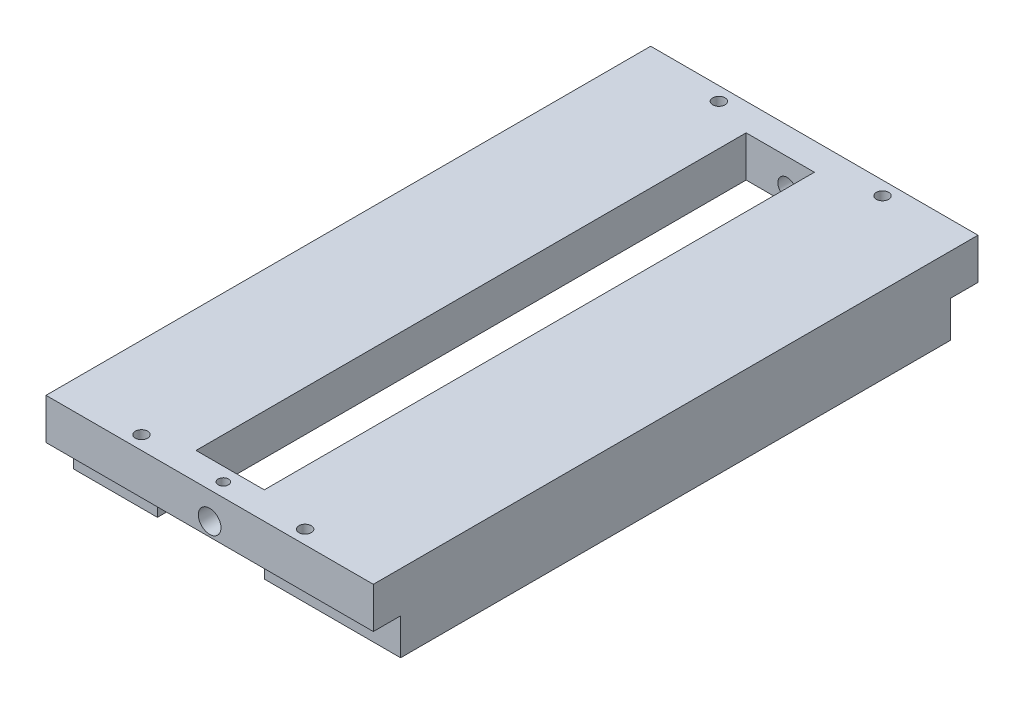
ISO-10303-21;
HEADER;
FILE_DESCRIPTION(('STEP AP214'),'2;1');
FILE_NAME('part.step','',(''),(''),'','','');
FILE_SCHEMA(('AUTOMOTIVE_DESIGN { 1 0 10303 214 1 1 1 1 }'));
ENDSEC;
DATA;
#1=APPLICATION_CONTEXT('core data for automotive mechanical design processes');
#2=APPLICATION_PROTOCOL_DEFINITION('international standard','automotive_design',2000,#1);
#3=PRODUCT_CONTEXT('',#1,'mechanical');
#4=PRODUCT('Part','Part','',(#3));
#5=PRODUCT_RELATED_PRODUCT_CATEGORY('part','',(#4));
#6=PRODUCT_DEFINITION_FORMATION('','',#4);
#7=PRODUCT_DEFINITION_CONTEXT('part definition',#1,'design');
#8=PRODUCT_DEFINITION('design','',#6,#7);
#9=PRODUCT_DEFINITION_SHAPE('','',#8);
#10=(LENGTH_UNIT() NAMED_UNIT(*) SI_UNIT(.MILLI.,.METRE.));
#11=(NAMED_UNIT(*) PLANE_ANGLE_UNIT() SI_UNIT($,.RADIAN.));
#12=(NAMED_UNIT(*) SI_UNIT($,.STERADIAN.) SOLID_ANGLE_UNIT());
#13=UNCERTAINTY_MEASURE_WITH_UNIT(LENGTH_MEASURE(1.E-05),#10,'distance_accuracy_value','');
#14=(GEOMETRIC_REPRESENTATION_CONTEXT(3) GLOBAL_UNCERTAINTY_ASSIGNED_CONTEXT((#13)) GLOBAL_UNIT_ASSIGNED_CONTEXT((#10,
#11,#12)) REPRESENTATION_CONTEXT('',''));
#15=CARTESIAN_POINT('',(0.,0.,0.));
#16=DIRECTION('',(0.,0.,1.));
#17=DIRECTION('',(1.,0.,0.));
#18=AXIS2_PLACEMENT_3D('',#15,#16,#17);
#19=CARTESIAN_POINT('',(0.,-9.,0.));
#20=DIRECTION('',(0.,1.,0.));
#21=DIRECTION('',(0.,0.,1.));
#22=AXIS2_PLACEMENT_3D('',#19,#20,#21);
#23=PLANE('',#22);
#24=CARTESIAN_POINT('',(-18.,-9.,-63.5));
#25=DIRECTION('',(0.,1.,0.));
#26=DIRECTION('',(0.,0.,1.));
#27=AXIS2_PLACEMENT_3D('',#24,#25,#26);
#28=CIRCLE('',#27,1.35254999999999);
#29=CARTESIAN_POINT('',(-18.,-9.,-62.14745));
#30=VERTEX_POINT('',#29);
#31=EDGE_CURVE('E427',#30,#30,#28,.T.);
#32=ORIENTED_EDGE('',*,*,#31,.T.);
#33=EDGE_LOOP('',(#32));
#34=FACE_BOUND('',#33,.T.);
#35=CARTESIAN_POINT('',(18.,-9.,-63.5));
#36=DIRECTION('',(0.,1.,0.));
#37=DIRECTION('',(0.,0.,1.));
#38=AXIS2_PLACEMENT_3D('',#35,#36,#37);
#39=CIRCLE('',#38,1.35254999999999);
#40=CARTESIAN_POINT('',(18.,-9.,-62.14745));
#41=VERTEX_POINT('',#40);
#42=EDGE_CURVE('E433',#41,#41,#39,.T.);
#43=ORIENTED_EDGE('',*,*,#42,.T.);
#44=EDGE_LOOP('',(#43));
#45=FACE_BOUND('',#44,.T.);
#46=CARTESIAN_POINT('',(18.,-9.,63.5));
#47=DIRECTION('',(0.,1.,0.));
#48=DIRECTION('',(0.,0.,1.));
#49=AXIS2_PLACEMENT_3D('',#46,#47,#48);
#50=CIRCLE('',#49,1.35254999999999);
#51=CARTESIAN_POINT('',(18.,-9.,64.85255));
#52=VERTEX_POINT('',#51);
#53=EDGE_CURVE('E56',#52,#52,#50,.T.);
#54=ORIENTED_EDGE('',*,*,#53,.T.);
#55=EDGE_LOOP('',(#54));
#56=FACE_BOUND('',#55,.T.);
#57=CARTESIAN_POINT('',(-18.,-9.,63.5));
#58=DIRECTION('',(0.,1.,0.));
#59=DIRECTION('',(0.,0.,1.));
#60=AXIS2_PLACEMENT_3D('',#57,#58,#59);
#61=CIRCLE('',#60,1.35254999999999);
#62=CARTESIAN_POINT('',(-18.,-9.,64.85255));
#63=VERTEX_POINT('',#62);
#64=EDGE_CURVE('E442',#63,#63,#61,.T.);
#65=ORIENTED_EDGE('',*,*,#64,.T.);
#66=EDGE_LOOP('',(#65));
#67=FACE_BOUND('',#66,.T.);
#68=DIRECTION('',(1.,0.,0.));
#69=VECTOR('',#68,1.);
#70=CARTESIAN_POINT('',(-42.875,-9.,-60.5));
#71=LINE('',#70,#69);
#72=CARTESIAN_POINT('',(6.0127,-9.,-60.5));
#73=VERTEX_POINT('',#72);
#74=CARTESIAN_POINT('',(36.,-9.,-60.5));
#75=VERTEX_POINT('',#74);
#76=EDGE_CURVE('E171',#73,#75,#71,.T.);
#77=ORIENTED_EDGE('',*,*,#76,.F.);
#78=DIRECTION('',(-1.,0.,0.));
#79=VECTOR('',#78,1.);
#80=CARTESIAN_POINT('',(0.,-9.,-60.5));
#81=LINE('',#80,#79);
#82=CARTESIAN_POINT('',(-9.,-9.,-60.5));
#83=VERTEX_POINT('',#82);
#84=EDGE_CURVE('E174',#73,#83,#81,.T.);
#85=ORIENTED_EDGE('',*,*,#84,.T.);
#86=DIRECTION('',(0.,0.,1.));
#87=VECTOR('',#86,1.);
#88=CARTESIAN_POINT('',(-9.,-9.,0.));
#89=LINE('',#88,#87);
#90=CARTESIAN_POINT('',(-9.,-9.,60.5));
#91=VERTEX_POINT('',#90);
#92=EDGE_CURVE('E193',#83,#91,#89,.T.);
#93=ORIENTED_EDGE('',*,*,#92,.T.);
#94=DIRECTION('',(1.,0.,0.));
#95=VECTOR('',#94,1.);
#96=CARTESIAN_POINT('',(0.,-9.,60.5));
#97=LINE('',#96,#95);
#98=CARTESIAN_POINT('',(6.01270000000001,-9.,60.5));
#99=VERTEX_POINT('',#98);
#100=EDGE_CURVE('E256',#91,#99,#97,.T.);
#101=ORIENTED_EDGE('',*,*,#100,.T.);
#102=DIRECTION('',(-1.,0.,0.));
#103=VECTOR('',#102,1.);
#104=CARTESIAN_POINT('',(-42.875,-9.,60.5));
#105=LINE('',#104,#103);
#106=CARTESIAN_POINT('',(36.,-9.,60.5));
#107=VERTEX_POINT('',#106);
#108=EDGE_CURVE('E182',#107,#99,#105,.T.);
#109=ORIENTED_EDGE('',*,*,#108,.F.);
#110=DIRECTION('',(0.,0.,1.));
#111=VECTOR('',#110,1.);
#112=CARTESIAN_POINT('',(36.,-9.,-66.501));
#113=LINE('',#112,#111);
#114=CARTESIAN_POINT('',(36.,-9.,66.5));
#115=VERTEX_POINT('',#114);
#116=EDGE_CURVE('E288',#107,#115,#113,.T.);
#117=ORIENTED_EDGE('',*,*,#116,.T.);
#118=DIRECTION('',(1.,0.,0.));
#119=VECTOR('',#118,1.);
#120=CARTESIAN_POINT('',(-45.5,-9.,66.5));
#121=LINE('',#120,#119);
#122=CARTESIAN_POINT('',(-36.,-9.,66.5));
#123=VERTEX_POINT('',#122);
#124=EDGE_CURVE('E62',#123,#115,#121,.T.);
#125=ORIENTED_EDGE('',*,*,#124,.F.);
#126=DIRECTION('',(0.,0.,1.));
#127=VECTOR('',#126,1.);
#128=CARTESIAN_POINT('',(-36.,-9.,-66.501));
#129=LINE('',#128,#127);
#130=CARTESIAN_POINT('',(-36.,-9.,60.5));
#131=VERTEX_POINT('',#130);
#132=EDGE_CURVE('E453',#131,#123,#129,.T.);
#133=ORIENTED_EDGE('',*,*,#132,.F.);
#134=CARTESIAN_POINT('',(-17.5,-9.,60.5));
#135=VERTEX_POINT('',#134);
#136=EDGE_CURVE('E793',#135,#131,#105,.T.);
#137=ORIENTED_EDGE('',*,*,#136,.F.);
#138=DIRECTION('',(0.,0.,1.));
#139=VECTOR('',#138,1.);
#140=CARTESIAN_POINT('',(-17.5,-9.,-66.5));
#141=LINE('',#140,#139);
#142=CARTESIAN_POINT('',(-17.5,-9.,-60.5));
#143=VERTEX_POINT('',#142);
#144=EDGE_CURVE('E251',#143,#135,#141,.T.);
#145=ORIENTED_EDGE('',*,*,#144,.F.);
#146=CARTESIAN_POINT('',(-36.,-9.,-60.5));
#147=VERTEX_POINT('',#146);
#148=EDGE_CURVE('E181',#147,#143,#71,.T.);
#149=ORIENTED_EDGE('',*,*,#148,.F.);
#150=CARTESIAN_POINT('',(-36.,-9.,-66.5));
#151=VERTEX_POINT('',#150);
#152=EDGE_CURVE('E449',#151,#147,#129,.T.);
#153=ORIENTED_EDGE('',*,*,#152,.F.);
#154=DIRECTION('',(-1.,0.,0.));
#155=VECTOR('',#154,1.);
#156=CARTESIAN_POINT('',(45.5,-9.,-66.5));
#157=LINE('',#156,#155);
#158=CARTESIAN_POINT('',(36.,-9.,-66.5));
#159=VERTEX_POINT('',#158);
#160=EDGE_CURVE('E13',#159,#151,#157,.T.);
#161=ORIENTED_EDGE('',*,*,#160,.F.);
#162=EDGE_CURVE('E176',#159,#75,#113,.T.);
#163=ORIENTED_EDGE('',*,*,#162,.T.);
#164=EDGE_LOOP('',(#77,#85,#93,#101,#109,#117,#125,#133,#137,#145,#149,#153,#161,#163));
#165=FACE_BOUND('',#164,.T.);
#166=ADVANCED_FACE('F52',(#34,#45,#56,#67,#165),#23,.F.);
#167=CARTESIAN_POINT('',(-42.875,-17.,60.5));
#168=DIRECTION('',(0.,0.,-1.));
#169=DIRECTION('',(-1.,0.,0.));
#170=AXIS2_PLACEMENT_3D('',#167,#168,#169);
#171=PLANE('',#170);
#172=DIRECTION('',(0.,1.,0.));
#173=VECTOR('',#172,1.);
#174=CARTESIAN_POINT('',(-36.,-17.,60.5));
#175=LINE('',#174,#173);
#176=CARTESIAN_POINT('',(-36.,-17.,60.5));
#177=VERTEX_POINT('',#176);
#178=EDGE_CURVE('E266',#177,#131,#175,.T.);
#179=ORIENTED_EDGE('',*,*,#178,.F.);
#180=DIRECTION('',(-1.,0.,0.));
#181=VECTOR('',#180,1.);
#182=CARTESIAN_POINT('',(-42.875,-17.,60.5));
#183=LINE('',#182,#181);
#184=CARTESIAN_POINT('',(-17.5,-17.,60.5));
#185=VERTEX_POINT('',#184);
#186=EDGE_CURVE('E304',#185,#177,#183,.T.);
#187=ORIENTED_EDGE('',*,*,#186,.F.);
#188=DIRECTION('',(0.,1.,0.));
#189=VECTOR('',#188,1.);
#190=CARTESIAN_POINT('',(-17.5,-17.,60.5));
#191=LINE('',#190,#189);
#192=EDGE_CURVE('E602',#185,#135,#191,.T.);
#193=ORIENTED_EDGE('',*,*,#192,.T.);
#194=ORIENTED_EDGE('',*,*,#136,.T.);
#195=EDGE_LOOP('',(#179,#187,#193,#194));
#196=FACE_BOUND('',#195,.T.);
#197=ADVANCED_FACE('F358',(#196),#171,.F.);
#198=CARTESIAN_POINT('',(-42.875,-17.,-60.5));
#199=DIRECTION('',(0.,0.,1.));
#200=DIRECTION('',(1.,0.,0.));
#201=AXIS2_PLACEMENT_3D('',#198,#199,#200);
#202=PLANE('',#201);
#203=DIRECTION('',(0.,-1.,0.));
#204=VECTOR('',#203,1.);
#205=CARTESIAN_POINT('',(-36.,-17.,-60.5));
#206=LINE('',#205,#204);
#207=CARTESIAN_POINT('',(-36.,-17.,-60.5));
#208=VERTEX_POINT('',#207);
#209=EDGE_CURVE('E271',#147,#208,#206,.T.);
#210=ORIENTED_EDGE('',*,*,#209,.F.);
#211=ORIENTED_EDGE('',*,*,#148,.T.);
#212=DIRECTION('',(0.,-1.,0.));
#213=VECTOR('',#212,1.);
#214=CARTESIAN_POINT('',(-17.5,-17.,-60.5));
#215=LINE('',#214,#213);
#216=CARTESIAN_POINT('',(-17.5,-17.,-60.5));
#217=VERTEX_POINT('',#216);
#218=EDGE_CURVE('E254',#143,#217,#215,.T.);
#219=ORIENTED_EDGE('',*,*,#218,.T.);
#220=DIRECTION('',(1.,0.,0.));
#221=VECTOR('',#220,1.);
#222=CARTESIAN_POINT('',(-42.875,-17.,-60.5));
#223=LINE('',#222,#221);
#224=EDGE_CURVE('E307',#208,#217,#223,.T.);
#225=ORIENTED_EDGE('',*,*,#224,.F.);
#226=EDGE_LOOP('',(#210,#211,#219,#225));
#227=FACE_BOUND('',#226,.T.);
#228=ADVANCED_FACE('F363',(#227),#202,.F.);
#229=CARTESIAN_POINT('',(0.,-17.,0.));
#230=DIRECTION('',(0.,-1.,0.));
#231=DIRECTION('',(0.,0.,-1.));
#232=AXIS2_PLACEMENT_3D('',#229,#230,#231);
#233=PLANE('',#232);
#234=ORIENTED_EDGE('',*,*,#186,.T.);
#235=DIRECTION('',(0.,0.,1.));
#236=VECTOR('',#235,1.);
#237=CARTESIAN_POINT('',(-36.,-17.,-66.5));
#238=LINE('',#237,#236);
#239=EDGE_CURVE('E214',#208,#177,#238,.T.);
#240=ORIENTED_EDGE('',*,*,#239,.F.);
#241=ORIENTED_EDGE('',*,*,#224,.T.);
#242=DIRECTION('',(0.,0.,1.));
#243=VECTOR('',#242,1.);
#244=CARTESIAN_POINT('',(-17.5,-17.,-66.5));
#245=LINE('',#244,#243);
#246=EDGE_CURVE('E255',#217,#185,#245,.T.);
#247=ORIENTED_EDGE('',*,*,#246,.T.);
#248=EDGE_LOOP('',(#234,#240,#241,#247));
#249=FACE_BOUND('',#248,.T.);
#250=ADVANCED_FACE('F373',(#249),#233,.T.);
#251=DIRECTION('',(0.,-1.,0.));
#252=VECTOR('',#251,1.);
#253=CARTESIAN_POINT('',(36.,-17.,60.5));
#254=LINE('',#253,#252);
#255=CARTESIAN_POINT('',(36.,-17.,60.5));
#256=VERTEX_POINT('',#255);
#257=EDGE_CURVE('E275',#107,#256,#254,.T.);
#258=ORIENTED_EDGE('',*,*,#257,.F.);
#259=ORIENTED_EDGE('',*,*,#108,.T.);
#260=DIRECTION('',(0.,1.,0.));
#261=VECTOR('',#260,1.);
#262=CARTESIAN_POINT('',(6.0127,-138.544058107708,60.5));
#263=LINE('',#262,#261);
#264=CARTESIAN_POINT('',(6.0127,-17.,60.5));
#265=VERTEX_POINT('',#264);
#266=EDGE_CURVE('E210',#265,#99,#263,.T.);
#267=ORIENTED_EDGE('',*,*,#266,.F.);
#268=EDGE_CURVE('E299',#256,#265,#183,.T.);
#269=ORIENTED_EDGE('',*,*,#268,.F.);
#270=EDGE_LOOP('',(#258,#259,#267,#269));
#271=FACE_BOUND('',#270,.T.);
#272=ADVANCED_FACE('F366',(#271),#171,.F.);
#273=DIRECTION('',(0.,1.,0.));
#274=VECTOR('',#273,1.);
#275=CARTESIAN_POINT('',(36.,-17.,-60.5));
#276=LINE('',#275,#274);
#277=CARTESIAN_POINT('',(36.,-17.,-60.5));
#278=VERTEX_POINT('',#277);
#279=EDGE_CURVE('E270',#278,#75,#276,.T.);
#280=ORIENTED_EDGE('',*,*,#279,.F.);
#281=CARTESIAN_POINT('',(6.0127,-17.,-60.5));
#282=VERTEX_POINT('',#281);
#283=EDGE_CURVE('E209',#282,#278,#223,.T.);
#284=ORIENTED_EDGE('',*,*,#283,.F.);
#285=DIRECTION('',(0.,1.,0.));
#286=VECTOR('',#285,1.);
#287=CARTESIAN_POINT('',(6.0127,-138.544058107708,-60.5));
#288=LINE('',#287,#286);
#289=EDGE_CURVE('E200',#282,#73,#288,.T.);
#290=ORIENTED_EDGE('',*,*,#289,.T.);
#291=ORIENTED_EDGE('',*,*,#76,.T.);
#292=EDGE_LOOP('',(#280,#284,#290,#291));
#293=FACE_BOUND('',#292,.T.);
#294=ADVANCED_FACE('F207',(#293),#202,.F.);
#295=ORIENTED_EDGE('',*,*,#283,.T.);
#296=DIRECTION('',(0.,0.,-1.));
#297=VECTOR('',#296,1.);
#298=CARTESIAN_POINT('',(36.,-17.,-66.5));
#299=LINE('',#298,#297);
#300=EDGE_CURVE('E809',#256,#278,#299,.T.);
#301=ORIENTED_EDGE('',*,*,#300,.F.);
#302=ORIENTED_EDGE('',*,*,#268,.T.);
#303=DIRECTION('',(0.,0.,-1.));
#304=VECTOR('',#303,1.);
#305=CARTESIAN_POINT('',(6.0127,-17.,60.5));
#306=LINE('',#305,#304);
#307=EDGE_CURVE('E211',#265,#282,#306,.T.);
#308=ORIENTED_EDGE('',*,*,#307,.T.);
#309=EDGE_LOOP('',(#295,#301,#302,#308));
#310=FACE_BOUND('',#309,.T.);
#311=CARTESIAN_POINT('',(12.7,-17.,-38.1));
#312=DIRECTION('',(0.,-1.,0.));
#313=DIRECTION('',(0.,0.,-1.));
#314=AXIS2_PLACEMENT_3D('',#311,#312,#313);
#315=CIRCLE('',#314,1.5875);
#316=CARTESIAN_POINT('',(12.7,-17.,-39.6875));
#317=VERTEX_POINT('',#316);
#318=EDGE_CURVE('E223',#317,#317,#315,.T.);
#319=ORIENTED_EDGE('',*,*,#318,.F.);
#320=EDGE_LOOP('',(#319));
#321=FACE_BOUND('',#320,.T.);
#322=CARTESIAN_POINT('',(12.7,-17.,38.1));
#323=DIRECTION('',(0.,-1.,0.));
#324=DIRECTION('',(0.,0.,-1.));
#325=AXIS2_PLACEMENT_3D('',#322,#323,#324);
#326=CIRCLE('',#325,1.5875);
#327=CARTESIAN_POINT('',(12.7,-17.,36.5125));
#328=VERTEX_POINT('',#327);
#329=EDGE_CURVE('E217',#328,#328,#326,.T.);
#330=ORIENTED_EDGE('',*,*,#329,.F.);
#331=EDGE_LOOP('',(#330));
#332=FACE_BOUND('',#331,.T.);
#333=ADVANCED_FACE('F378',(#310,#321,#332),#233,.T.);
#334=CARTESIAN_POINT('',(-45.5,-9.,66.5));
#335=DIRECTION('',(0.,0.,1.));
#336=DIRECTION('',(1.,0.,0.));
#337=AXIS2_PLACEMENT_3D('',#334,#335,#336);
#338=PLANE('',#337);
#339=DIRECTION('',(0.,-1.,0.));
#340=VECTOR('',#339,1.);
#341=CARTESIAN_POINT('',(36.,-9.,66.5));
#342=LINE('',#341,#340);
#343=CARTESIAN_POINT('',(36.,0.,66.5));
#344=VERTEX_POINT('',#343);
#345=EDGE_CURVE('E281',#344,#115,#342,.T.);
#346=ORIENTED_EDGE('',*,*,#345,.F.);
#347=DIRECTION('',(1.,0.,0.));
#348=VECTOR('',#347,1.);
#349=CARTESIAN_POINT('',(-45.5,0.,66.5));
#350=LINE('',#349,#348);
#351=CARTESIAN_POINT('',(-36.,0.,66.5));
#352=VERTEX_POINT('',#351);
#353=EDGE_CURVE('E469',#352,#344,#350,.T.);
#354=ORIENTED_EDGE('',*,*,#353,.F.);
#355=DIRECTION('',(0.,1.,0.));
#356=VECTOR('',#355,1.);
#357=CARTESIAN_POINT('',(-36.,-9.,66.5));
#358=LINE('',#357,#356);
#359=EDGE_CURVE('E456',#123,#352,#358,.T.);
#360=ORIENTED_EDGE('',*,*,#359,.F.);
#361=ORIENTED_EDGE('',*,*,#124,.T.);
#362=EDGE_LOOP('',(#346,#354,#360,#361));
#363=FACE_BOUND('',#362,.T.);
#364=CARTESIAN_POINT('',(0.,-6.,66.5));
#365=DIRECTION('',(0.,0.,1.));
#366=DIRECTION('',(1.,0.,0.));
#367=AXIS2_PLACEMENT_3D('',#364,#365,#366);
#368=CIRCLE('',#367,2.4892);
#369=CARTESIAN_POINT('',(2.4892,-6.,66.5));
#370=VERTEX_POINT('',#369);
#371=EDGE_CURVE('E321',#370,#370,#368,.T.);
#372=ORIENTED_EDGE('',*,*,#371,.F.);
#373=EDGE_LOOP('',(#372));
#374=FACE_BOUND('',#373,.T.);
#375=ADVANCED_FACE('F54',(#363,#374),#338,.T.);
#376=CARTESIAN_POINT('',(45.5,-9.,-66.5));
#377=DIRECTION('',(0.,0.,-1.));
#378=DIRECTION('',(-1.,0.,0.));
#379=AXIS2_PLACEMENT_3D('',#376,#377,#378);
#380=PLANE('',#379);
#381=DIRECTION('',(0.,-1.,0.));
#382=VECTOR('',#381,1.);
#383=CARTESIAN_POINT('',(36.,-9.,-66.5));
#384=LINE('',#383,#382);
#385=CARTESIAN_POINT('',(36.,0.,-66.5));
#386=VERTEX_POINT('',#385);
#387=EDGE_CURVE('E278',#386,#159,#384,.T.);
#388=ORIENTED_EDGE('',*,*,#387,.T.);
#389=ORIENTED_EDGE('',*,*,#160,.T.);
#390=DIRECTION('',(0.,1.,0.));
#391=VECTOR('',#390,1.);
#392=CARTESIAN_POINT('',(-36.,-9.,-66.5));
#393=LINE('',#392,#391);
#394=CARTESIAN_POINT('',(-36.,0.,-66.5));
#395=VERTEX_POINT('',#394);
#396=EDGE_CURVE('E277',#151,#395,#393,.T.);
#397=ORIENTED_EDGE('',*,*,#396,.T.);
#398=DIRECTION('',(-1.,0.,0.));
#399=VECTOR('',#398,1.);
#400=CARTESIAN_POINT('',(45.5,0.,-66.5));
#401=LINE('',#400,#399);
#402=EDGE_CURVE('E465',#386,#395,#401,.T.);
#403=ORIENTED_EDGE('',*,*,#402,.F.);
#404=EDGE_LOOP('',(#388,#389,#397,#403));
#405=FACE_BOUND('',#404,.T.);
#406=CARTESIAN_POINT('',(0.,-6.,-66.5));
#407=DIRECTION('',(0.,0.,-1.));
#408=DIRECTION('',(-1.,0.,0.));
#409=AXIS2_PLACEMENT_3D('',#406,#407,#408);
#410=CIRCLE('',#409,2.0193);
#411=CARTESIAN_POINT('',(-2.0193,-6.,-66.5));
#412=VERTEX_POINT('',#411);
#413=EDGE_CURVE('E325',#412,#412,#410,.T.);
#414=ORIENTED_EDGE('',*,*,#413,.F.);
#415=EDGE_LOOP('',(#414));
#416=FACE_BOUND('',#415,.T.);
#417=ADVANCED_FACE('F343',(#405,#416),#380,.T.);
#418=CARTESIAN_POINT('',(0.,0.,0.));
#419=DIRECTION('',(0.,1.,0.));
#420=DIRECTION('',(0.,0.,1.));
#421=AXIS2_PLACEMENT_3D('',#418,#419,#420);
#422=PLANE('',#421);
#423=DIRECTION('',(0.,0.,1.));
#424=VECTOR('',#423,1.);
#425=CARTESIAN_POINT('',(36.,0.,-66.501));
#426=LINE('',#425,#424);
#427=EDGE_CURVE('E284',#386,#344,#426,.T.);
#428=ORIENTED_EDGE('',*,*,#427,.F.);
#429=ORIENTED_EDGE('',*,*,#402,.T.);
#430=DIRECTION('',(0.,0.,1.));
#431=VECTOR('',#430,1.);
#432=CARTESIAN_POINT('',(-36.,0.,-66.501));
#433=LINE('',#432,#431);
#434=EDGE_CURVE('E282',#395,#352,#433,.T.);
#435=ORIENTED_EDGE('',*,*,#434,.T.);
#436=ORIENTED_EDGE('',*,*,#353,.T.);
#437=EDGE_LOOP('',(#428,#429,#435,#436));
#438=FACE_BOUND('',#437,.T.);
#439=CARTESIAN_POINT('',(-18.,0.,63.5));
#440=DIRECTION('',(0.,1.,0.));
#441=DIRECTION('',(0.,0.,1.));
#442=AXIS2_PLACEMENT_3D('',#439,#440,#441);
#443=CIRCLE('',#442,1.35254999999999);
#444=CARTESIAN_POINT('',(-18.,0.,64.85255));
#445=VERTEX_POINT('',#444);
#446=EDGE_CURVE('E287',#445,#445,#443,.T.);
#447=ORIENTED_EDGE('',*,*,#446,.F.);
#448=EDGE_LOOP('',(#447));
#449=FACE_BOUND('',#448,.T.);
#450=CARTESIAN_POINT('',(18.,0.,63.5));
#451=DIRECTION('',(0.,1.,0.));
#452=DIRECTION('',(0.,0.,1.));
#453=AXIS2_PLACEMENT_3D('',#450,#451,#452);
#454=CIRCLE('',#453,1.35254999999999);
#455=CARTESIAN_POINT('',(18.,0.,64.85255));
#456=VERTEX_POINT('',#455);
#457=EDGE_CURVE('E438',#456,#456,#454,.T.);
#458=ORIENTED_EDGE('',*,*,#457,.F.);
#459=EDGE_LOOP('',(#458));
#460=FACE_BOUND('',#459,.T.);
#461=CARTESIAN_POINT('',(18.,0.,-63.5));
#462=DIRECTION('',(0.,1.,0.));
#463=DIRECTION('',(0.,0.,1.));
#464=AXIS2_PLACEMENT_3D('',#461,#462,#463);
#465=CIRCLE('',#464,1.35254999999999);
#466=CARTESIAN_POINT('',(18.,0.,-62.14745));
#467=VERTEX_POINT('',#466);
#468=EDGE_CURVE('E434',#467,#467,#465,.T.);
#469=ORIENTED_EDGE('',*,*,#468,.F.);
#470=EDGE_LOOP('',(#469));
#471=FACE_BOUND('',#470,.T.);
#472=CARTESIAN_POINT('',(-18.,0.,-63.5));
#473=DIRECTION('',(0.,1.,0.));
#474=DIRECTION('',(0.,0.,1.));
#475=AXIS2_PLACEMENT_3D('',#472,#473,#474);
#476=CIRCLE('',#475,1.35254999999999);
#477=CARTESIAN_POINT('',(-18.,0.,-62.14745));
#478=VERTEX_POINT('',#477);
#479=EDGE_CURVE('E429',#478,#478,#476,.T.);
#480=ORIENTED_EDGE('',*,*,#479,.F.);
#481=EDGE_LOOP('',(#480));
#482=FACE_BOUND('',#481,.T.);
#483=CARTESIAN_POINT('',(0.,0.,63.5));
#484=DIRECTION('',(0.,1.,0.));
#485=DIRECTION('',(0.,0.,1.));
#486=AXIS2_PLACEMENT_3D('',#483,#484,#485);
#487=CIRCLE('',#486,1.1303);
#488=CARTESIAN_POINT('',(0.,0.,64.6303));
#489=VERTEX_POINT('',#488);
#490=EDGE_CURVE('E423',#489,#489,#487,.T.);
#491=ORIENTED_EDGE('',*,*,#490,.F.);
#492=EDGE_LOOP('',(#491));
#493=FACE_BOUND('',#492,.T.);
#494=DIRECTION('',(1.,0.,0.));
#495=VECTOR('',#494,1.);
#496=CARTESIAN_POINT('',(-6.,0.,60.5));
#497=LINE('',#496,#495);
#498=CARTESIAN_POINT('',(-9.,0.,60.5));
#499=VERTEX_POINT('',#498);
#500=CARTESIAN_POINT('',(6.01270000000001,0.,60.5));
#501=VERTEX_POINT('',#500);
#502=EDGE_CURVE('E70',#499,#501,#497,.T.);
#503=ORIENTED_EDGE('',*,*,#502,.F.);
#504=DIRECTION('',(0.,0.,1.));
#505=VECTOR('',#504,1.);
#506=CARTESIAN_POINT('',(-9.,0.,60.5));
#507=LINE('',#506,#505);
#508=CARTESIAN_POINT('',(-9.,0.,-60.5));
#509=VERTEX_POINT('',#508);
#510=EDGE_CURVE('E238',#509,#499,#507,.T.);
#511=ORIENTED_EDGE('',*,*,#510,.F.);
#512=DIRECTION('',(-1.,0.,0.));
#513=VECTOR('',#512,1.);
#514=CARTESIAN_POINT('',(-9.,0.,-60.5));
#515=LINE('',#514,#513);
#516=CARTESIAN_POINT('',(6.0127,0.,-60.5));
#517=VERTEX_POINT('',#516);
#518=EDGE_CURVE('E330',#517,#509,#515,.T.);
#519=ORIENTED_EDGE('',*,*,#518,.F.);
#520=DIRECTION('',(0.,0.,-1.));
#521=VECTOR('',#520,1.);
#522=CARTESIAN_POINT('',(6.0127,0.,-60.5));
#523=LINE('',#522,#521);
#524=EDGE_CURVE('E203',#501,#517,#523,.T.);
#525=ORIENTED_EDGE('',*,*,#524,.F.);
#526=EDGE_LOOP('',(#503,#511,#519,#525));
#527=FACE_BOUND('',#526,.T.);
#528=ADVANCED_FACE('F340',(#438,#449,#460,#471,#482,#493,#527),#422,.T.);
#529=CARTESIAN_POINT('',(-17.5,-17.,-66.5));
#530=DIRECTION('',(-1.,0.,0.));
#531=DIRECTION('',(0.,0.,1.));
#532=AXIS2_PLACEMENT_3D('',#529,#530,#531);
#533=PLANE('',#532);
#534=ORIENTED_EDGE('',*,*,#246,.F.);
#535=ORIENTED_EDGE('',*,*,#218,.F.);
#536=ORIENTED_EDGE('',*,*,#144,.T.);
#537=ORIENTED_EDGE('',*,*,#192,.F.);
#538=EDGE_LOOP('',(#534,#535,#536,#537));
#539=FACE_BOUND('',#538,.T.);
#540=ADVANCED_FACE('F342',(#539),#533,.F.);
#541=CARTESIAN_POINT('',(-6.,-17.,60.5));
#542=DIRECTION('',(0.,0.,1.));
#543=DIRECTION('',(1.,0.,0.));
#544=AXIS2_PLACEMENT_3D('',#541,#542,#543);
#545=PLANE('',#544);
#546=CARTESIAN_POINT('',(0.,-6.,60.5));
#547=DIRECTION('',(0.,0.,1.));
#548=DIRECTION('',(1.,0.,0.));
#549=AXIS2_PLACEMENT_3D('',#546,#547,#548);
#550=CIRCLE('',#549,2.4892);
#551=CARTESIAN_POINT('',(2.4892,-6.,60.5));
#552=VERTEX_POINT('',#551);
#553=EDGE_CURVE('E315',#552,#552,#550,.T.);
#554=ORIENTED_EDGE('',*,*,#553,.T.);
#555=EDGE_LOOP('',(#554));
#556=FACE_BOUND('',#555,.T.);
#557=DIRECTION('',(0.,1.,0.));
#558=VECTOR('',#557,1.);
#559=CARTESIAN_POINT('',(-9.,-17.,60.5));
#560=LINE('',#559,#558);
#561=EDGE_CURVE('E194',#91,#499,#560,.T.);
#562=ORIENTED_EDGE('',*,*,#561,.T.);
#563=ORIENTED_EDGE('',*,*,#502,.T.);
#564=DIRECTION('',(0.,1.,0.));
#565=VECTOR('',#564,1.);
#566=CARTESIAN_POINT('',(6.01270000000001,-17.,60.5));
#567=LINE('',#566,#565);
#568=EDGE_CURVE('E205',#99,#501,#567,.T.);
#569=ORIENTED_EDGE('',*,*,#568,.F.);
#570=ORIENTED_EDGE('',*,*,#100,.F.);
#571=EDGE_LOOP('',(#562,#563,#569,#570));
#572=FACE_BOUND('',#571,.T.);
#573=ADVANCED_FACE('F350',(#556,#572),#545,.F.);
#574=CARTESIAN_POINT('',(-9.,-17.,60.5));
#575=DIRECTION('',(-1.,0.,0.));
#576=DIRECTION('',(0.,0.,1.));
#577=AXIS2_PLACEMENT_3D('',#574,#575,#576);
#578=PLANE('',#577);
#579=DIRECTION('',(0.,1.,0.));
#580=VECTOR('',#579,1.);
#581=CARTESIAN_POINT('',(-9.,-17.,-60.5));
#582=LINE('',#581,#580);
#583=EDGE_CURVE('E191',#83,#509,#582,.T.);
#584=ORIENTED_EDGE('',*,*,#583,.T.);
#585=ORIENTED_EDGE('',*,*,#510,.T.);
#586=ORIENTED_EDGE('',*,*,#561,.F.);
#587=ORIENTED_EDGE('',*,*,#92,.F.);
#588=EDGE_LOOP('',(#584,#585,#586,#587));
#589=FACE_BOUND('',#588,.T.);
#590=ADVANCED_FACE('F338',(#589),#578,.F.);
#591=CARTESIAN_POINT('',(-9.,-17.,-60.5));
#592=DIRECTION('',(0.,0.,-1.));
#593=DIRECTION('',(-1.,0.,0.));
#594=AXIS2_PLACEMENT_3D('',#591,#592,#593);
#595=PLANE('',#594);
#596=CARTESIAN_POINT('',(0.,-6.,-60.5));
#597=DIRECTION('',(0.,0.,1.));
#598=DIRECTION('',(1.,0.,0.));
#599=AXIS2_PLACEMENT_3D('',#596,#597,#598);
#600=CIRCLE('',#599,2.0193);
#601=CARTESIAN_POINT('',(2.0193,-6.,-60.5));
#602=VERTEX_POINT('',#601);
#603=EDGE_CURVE('E320',#602,#602,#600,.T.);
#604=ORIENTED_EDGE('',*,*,#603,.F.);
#605=EDGE_LOOP('',(#604));
#606=FACE_BOUND('',#605,.T.);
#607=DIRECTION('',(0.,1.,0.));
#608=VECTOR('',#607,1.);
#609=CARTESIAN_POINT('',(6.0127,-17.,-60.5));
#610=LINE('',#609,#608);
#611=EDGE_CURVE('E189',#73,#517,#610,.T.);
#612=ORIENTED_EDGE('',*,*,#611,.T.);
#613=ORIENTED_EDGE('',*,*,#518,.T.);
#614=ORIENTED_EDGE('',*,*,#583,.F.);
#615=ORIENTED_EDGE('',*,*,#84,.F.);
#616=EDGE_LOOP('',(#612,#613,#614,#615));
#617=FACE_BOUND('',#616,.T.);
#618=ADVANCED_FACE('F187',(#606,#617),#595,.F.);
#619=CARTESIAN_POINT('',(6.0127,-17.,-60.5));
#620=DIRECTION('',(1.,0.,0.));
#621=DIRECTION('',(0.,0.,-1.));
#622=AXIS2_PLACEMENT_3D('',#619,#620,#621);
#623=PLANE('',#622);
#624=ORIENTED_EDGE('',*,*,#568,.T.);
#625=ORIENTED_EDGE('',*,*,#524,.T.);
#626=ORIENTED_EDGE('',*,*,#611,.F.);
#627=ORIENTED_EDGE('',*,*,#289,.F.);
#628=ORIENTED_EDGE('',*,*,#307,.F.);
#629=ORIENTED_EDGE('',*,*,#266,.T.);
#630=EDGE_LOOP('',(#624,#625,#626,#627,#628,#629));
#631=FACE_BOUND('',#630,.T.);
#632=ADVANCED_FACE('F198',(#631),#623,.F.);
#633=CARTESIAN_POINT('',(0.,-6.,-60.5));
#634=DIRECTION('',(0.,0.,1.));
#635=DIRECTION('',(1.,0.,0.));
#636=AXIS2_PLACEMENT_3D('',#633,#634,#635);
#637=CYLINDRICAL_SURFACE('',#636,2.0193);
#638=ORIENTED_EDGE('',*,*,#603,.T.);
#639=EDGE_LOOP('',(#638));
#640=FACE_BOUND('',#639,.T.);
#641=ORIENTED_EDGE('',*,*,#413,.T.);
#642=EDGE_LOOP('',(#641));
#643=FACE_BOUND('',#642,.T.);
#644=ADVANCED_FACE('F397',(#640,#643),#637,.F.);
#645=CARTESIAN_POINT('',(0.,-6.,66.5));
#646=DIRECTION('',(0.,0.,1.));
#647=DIRECTION('',(1.,0.,0.));
#648=AXIS2_PLACEMENT_3D('',#645,#646,#647);
#649=CYLINDRICAL_SURFACE('',#648,2.4892);
#650=CARTESIAN_POINT('',(0.,-3.5108,64.6303));
#651=CARTESIAN_POINT('',(0.060056135838076,-3.51080250440968,64.6302969752068));
#652=CARTESIAN_POINT('',(0.120202507005055,-3.51299757205286,64.6254853665584));
#653=CARTESIAN_POINT('',(0.238757197958987,-3.52156039707673,64.6064331688383));
#654=CARTESIAN_POINT('',(0.297161148372122,-3.52793785085249,64.5921706681266));
#655=CARTESIAN_POINT('',(0.410329103378066,-3.54418997702757,64.5548668156775));
#656=CARTESIAN_POINT('',(0.46510547472347,-3.5540519549254,64.5318573074486));
#657=CARTESIAN_POINT('',(0.56995725700031,-3.57633700312651,64.4778584684945));
#658=CARTESIAN_POINT('',(0.62003361370555,-3.58875955655571,64.446870747926));
#659=CARTESIAN_POINT('',(0.717025888352889,-3.6157482757836,64.3759275662042));
#660=CARTESIAN_POINT('',(0.763637890953407,-3.63039273851287,64.3355867293808));
#661=CARTESIAN_POINT('',(0.849704926724549,-3.65987356225277,64.2479022400807));
#662=CARTESIAN_POINT('',(0.889155505478825,-3.67471003659119,64.2005542621579));
#663=CARTESIAN_POINT('',(0.962170673814043,-3.70391965185796,64.096718864198));
#664=CARTESIAN_POINT('',(0.995230382237568,-3.71820952681672,64.0398504221871));
#665=CARTESIAN_POINT('',(1.05118059808001,-3.74343519282089,63.9206257448088));
#666=CARTESIAN_POINT('',(1.07407728455455,-3.7543730206348,63.8582728716518));
#667=CARTESIAN_POINT('',(1.10773964955028,-3.77079267878561,63.7333354096516));
#668=CARTESIAN_POINT('',(1.11909416373417,-3.77653747195833,63.6709455354614));
#669=CARTESIAN_POINT('',(1.1311773754086,-3.78265803417495,63.5449024880474));
#670=CARTESIAN_POINT('',(1.13191366018112,-3.783037636925,63.4812502494202));
#671=CARTESIAN_POINT('',(1.12317726650583,-3.7786030786901,63.3609152446279));
#672=CARTESIAN_POINT('',(1.11466065611655,-3.77427526835099,63.3041412392234));
#673=CARTESIAN_POINT('',(1.08928657660493,-3.76174857094766,63.1929383336492));
#674=CARTESIAN_POINT('',(1.07242712230291,-3.75354876256277,63.1385099949835));
#675=CARTESIAN_POINT('',(1.03051260015787,-3.73401163317297,63.0320572836989));
#676=CARTESIAN_POINT('',(1.00527979242666,-3.72260717190061,62.9801157815593));
#677=CARTESIAN_POINT('',(0.947463690969506,-3.69795405825184,62.8809789323647));
#678=CARTESIAN_POINT('',(0.914877246670172,-3.68470461635108,62.8337856321847));
#679=CARTESIAN_POINT('',(0.839382062616519,-3.65621225463152,62.7404091651792));
#680=CARTESIAN_POINT('',(0.795758886532201,-3.64090396196954,62.6948217472028));
#681=CARTESIAN_POINT('',(0.701367861523413,-3.61114089287393,62.6113884603875));
#682=CARTESIAN_POINT('',(0.650597671929755,-3.59668639827228,62.5735451377666));
#683=CARTESIAN_POINT('',(0.541251821789012,-3.56968513118483,62.5055667693252));
#684=CARTESIAN_POINT('',(0.482478054227108,-3.55721440678238,62.4757178535382));
#685=CARTESIAN_POINT('',(0.36003154123341,-3.53619368473543,62.4265476659275));
#686=CARTESIAN_POINT('',(0.296362052019128,-3.52764110696941,62.4072194645718));
#687=CARTESIAN_POINT('',(0.170870261895978,-3.51593049040786,62.3809873169349));
#688=CARTESIAN_POINT('',(0.109246825409292,-3.51242736092195,62.3732866584063));
#689=CARTESIAN_POINT('',(-0.0145080389439909,-3.51007415831674,62.3680994027212));
#690=CARTESIAN_POINT('',(-0.0766392759411288,-3.51122241049925,62.3706091293866));
#691=CARTESIAN_POINT('',(-0.195622629069639,-3.51782664351706,62.3852430037187));
#692=CARTESIAN_POINT('',(-0.252565043878056,-3.52301454789789,62.3967690303913));
#693=CARTESIAN_POINT('',(-0.363623117328209,-3.53686615083749,62.4282310821744));
#694=CARTESIAN_POINT('',(-0.417738436935604,-3.54553026519803,62.4481681133696));
#695=CARTESIAN_POINT('',(-0.523518770598739,-3.56586008785972,62.4965094119769));
#696=CARTESIAN_POINT('',(-0.575055623027641,-3.57761060309039,62.5251572499167));
#697=CARTESIAN_POINT('',(-0.672775553030269,-3.60290976527953,62.5898414983657));
#698=CARTESIAN_POINT('',(-0.718956269411401,-3.61645919966888,62.6258811482373));
#699=CARTESIAN_POINT('',(-0.808734636138106,-3.64533001629413,62.7078365731505));
#700=CARTESIAN_POINT('',(-0.851792107535295,-3.66070476582567,62.7543266642874));
#701=CARTESIAN_POINT('',(-0.92968664012759,-3.6905534646584,62.8540391047165));
#702=CARTESIAN_POINT('',(-0.964520366950681,-3.7050270468301,62.907264171361));
#703=CARTESIAN_POINT('',(-1.02580628868913,-3.73174302471176,63.0208613065035));
#704=CARTESIAN_POINT('',(-1.05200480489302,-3.7439140446762,63.0813883663144));
#705=CARTESIAN_POINT('',(-1.09358044440973,-3.76376690187288,63.2067293975326));
#706=CARTESIAN_POINT('',(-1.10896875721218,-3.77145337959045,63.2715388600128));
#707=CARTESIAN_POINT('',(-1.12728388422538,-3.78066604686503,63.3975232551787));
#708=CARTESIAN_POINT('',(-1.13118041039797,-3.78267100601707,63.4585222556846));
#709=CARTESIAN_POINT('',(-1.12908625228277,-3.78160344193644,63.5802975178431));
#710=CARTESIAN_POINT('',(-1.12309794049908,-3.77853213708034,63.6410738294355));
#711=CARTESIAN_POINT('',(-1.10226414149515,-3.76812847660427,63.7565327966669));
#712=CARTESIAN_POINT('',(-1.0880242735382,-3.76108829147842,63.8113538832289));
#713=CARTESIAN_POINT('',(-1.05174823157601,-3.7438210325053,63.9178141272821));
#714=CARTESIAN_POINT('',(-1.02970977723709,-3.7335930266326,63.9694523489014));
#715=CARTESIAN_POINT('',(-0.976824450637822,-3.71028034043233,64.0717710045728));
#716=CARTESIAN_POINT('',(-0.94549729712887,-3.69705297217907,64.122169916733));
#717=CARTESIAN_POINT('',(-0.875531102907614,-3.66955495231003,64.2172956217417));
#718=CARTESIAN_POINT('',(-0.836888844487358,-3.65528384328381,64.2620199039661));
#719=CARTESIAN_POINT('',(-0.749149818603571,-3.62571581386911,64.3488256717525));
#720=CARTESIAN_POINT('',(-0.699415210514419,-3.61044681839381,64.3902752668765));
#721=CARTESIAN_POINT('',(-0.593175290426295,-3.5818846867607,64.4643196093301));
#722=CARTESIAN_POINT('',(-0.536666861719543,-3.56859246648944,64.4969102578539));
#723=CARTESIAN_POINT('',(-0.418818502579405,-3.54555913514834,64.5518357980138));
#724=CARTESIAN_POINT('',(-0.357526218671964,-3.53578737552153,64.5742596662675));
#725=CARTESIAN_POINT('',(-0.231575867445508,-3.52079018179236,64.6082323071046));
#726=CARTESIAN_POINT('',(-0.1669285925979,-3.51555102430728,64.6198139156575));
#727=CARTESIAN_POINT('',(-0.0848652439817193,-3.51218864572047,64.6272385366416));
#728=CARTESIAN_POINT('',(-0.0679188617671505,-3.51166885757758,64.6283854428109));
#729=CARTESIAN_POINT('',(-0.0339840623431177,-3.51097417772164,64.6299166083007));
#730=CARTESIAN_POINT('',(-0.0169956444973098,-3.51079929126216,64.6303008560043));
#731=CARTESIAN_POINT('',(0.,-3.5108,64.6303));
#732=B_SPLINE_CURVE_WITH_KNOTS('',3,(#650,#651,#652,#653,#654,#655,#656,#657,#658,#659,#660,
#661,#662,#663,#664,#665,#666,#667,#668,#669,#670,#671,#672,#673,#674,#675,#676,#677,#678,#679,
#680,#681,#682,#683,#684,#685,#686,#687,#688,#689,#690,#691,#692,#693,#694,#695,#696,#697,#698,
#699,#700,#701,#702,#703,#704,#705,#706,#707,#708,#709,#710,#711,#712,#713,#714,#715,#716,#717,
#718,#719,#720,#721,#722,#723,#724,#725,#726,#727,#728,#729,#730,#731),.UNSPECIFIED.,.T.,.F.,(4,
2,2,2,2,2,2,2,2,2,2,2,2,2,2,2,2,2,2,2,2,2,2,2,2,2,2,2,2,2,2,2,2,2,2,2,2,2,2,2,4),(0.,
0.180098722521594,0.360616466935343,0.540483233611106,0.72031372813538,0.909584668843977,
1.09897293596233,1.2998968920481,1.50069851969393,1.6906458810503,1.88045750832117,
2.05237159118212,2.22432660068329,2.40019394547999,2.57613678197175,2.77005415224521,
2.96403517945551,3.16423726070854,3.36430731759863,3.54992326348957,3.73547238556876,
3.90965994689971,4.08386834963562,4.26348313247999,4.44317679792504,4.63791863643133,
4.83273929922564,5.03285775050125,5.23276875554982,5.41524589443955,5.59767924254429,
5.76816731390785,5.9387052778233,6.12035251288047,6.3020798358709,6.500696026452,
6.69940395580189,6.89633759492807,7.09267286917765,7.14363930577838,7.19460651869813),.UNSPECIFIED.);
#733=CARTESIAN_POINT('',(0.,-3.5108,64.6303));
#734=VERTEX_POINT('',#733);
#735=EDGE_CURVE('E418',#734,#734,#732,.T.);
#736=ORIENTED_EDGE('',*,*,#735,.T.);
#737=EDGE_LOOP('',(#736));
#738=FACE_BOUND('',#737,.T.);
#739=ORIENTED_EDGE('',*,*,#553,.F.);
#740=EDGE_LOOP('',(#739));
#741=FACE_BOUND('',#740,.T.);
#742=ORIENTED_EDGE('',*,*,#371,.T.);
#743=EDGE_LOOP('',(#742));
#744=FACE_BOUND('',#743,.T.);
#745=ADVANCED_FACE('F408',(#738,#741,#744),#649,.F.);
#746=CARTESIAN_POINT('',(0.,0.,63.5));
#747=DIRECTION('',(0.,1.,0.));
#748=DIRECTION('',(0.,0.,1.));
#749=AXIS2_PLACEMENT_3D('',#746,#747,#748);
#750=CYLINDRICAL_SURFACE('',#749,1.1303);
#751=ORIENTED_EDGE('',*,*,#735,.F.);
#752=EDGE_LOOP('',(#751));
#753=FACE_BOUND('',#752,.T.);
#754=ORIENTED_EDGE('',*,*,#490,.T.);
#755=EDGE_LOOP('',(#754));
#756=FACE_BOUND('',#755,.T.);
#757=ADVANCED_FACE('F412',(#753,#756),#750,.F.);
#758=CARTESIAN_POINT('',(-18.,0.,-63.5));
#759=DIRECTION('',(0.,1.,0.));
#760=DIRECTION('',(0.,0.,1.));
#761=AXIS2_PLACEMENT_3D('',#758,#759,#760);
#762=CYLINDRICAL_SURFACE('',#761,1.35254999999999);
#763=ORIENTED_EDGE('',*,*,#479,.T.);
#764=EDGE_LOOP('',(#763));
#765=FACE_BOUND('',#764,.T.);
#766=ORIENTED_EDGE('',*,*,#31,.F.);
#767=EDGE_LOOP('',(#766));
#768=FACE_BOUND('',#767,.T.);
#769=ADVANCED_FACE('F483',(#765,#768),#762,.F.);
#770=CARTESIAN_POINT('',(18.,0.,-63.5));
#771=DIRECTION('',(0.,1.,0.));
#772=DIRECTION('',(0.,0.,1.));
#773=AXIS2_PLACEMENT_3D('',#770,#771,#772);
#774=CYLINDRICAL_SURFACE('',#773,1.35254999999999);
#775=ORIENTED_EDGE('',*,*,#468,.T.);
#776=EDGE_LOOP('',(#775));
#777=FACE_BOUND('',#776,.T.);
#778=ORIENTED_EDGE('',*,*,#42,.F.);
#779=EDGE_LOOP('',(#778));
#780=FACE_BOUND('',#779,.T.);
#781=ADVANCED_FACE('F480',(#777,#780),#774,.F.);
#782=CARTESIAN_POINT('',(18.,0.,63.5));
#783=DIRECTION('',(0.,1.,0.));
#784=DIRECTION('',(0.,0.,1.));
#785=AXIS2_PLACEMENT_3D('',#782,#783,#784);
#786=CYLINDRICAL_SURFACE('',#785,1.35254999999999);
#787=ORIENTED_EDGE('',*,*,#457,.T.);
#788=EDGE_LOOP('',(#787));
#789=FACE_BOUND('',#788,.T.);
#790=ORIENTED_EDGE('',*,*,#53,.F.);
#791=EDGE_LOOP('',(#790));
#792=FACE_BOUND('',#791,.T.);
#793=ADVANCED_FACE('F482',(#789,#792),#786,.F.);
#794=CARTESIAN_POINT('',(-18.,0.,63.5));
#795=DIRECTION('',(0.,1.,0.));
#796=DIRECTION('',(0.,0.,1.));
#797=AXIS2_PLACEMENT_3D('',#794,#795,#796);
#798=CYLINDRICAL_SURFACE('',#797,1.35254999999999);
#799=ORIENTED_EDGE('',*,*,#446,.T.);
#800=EDGE_LOOP('',(#799));
#801=FACE_BOUND('',#800,.T.);
#802=ORIENTED_EDGE('',*,*,#64,.F.);
#803=EDGE_LOOP('',(#802));
#804=FACE_BOUND('',#803,.T.);
#805=ADVANCED_FACE('F490',(#801,#804),#798,.F.);
#806=CARTESIAN_POINT('',(36.,-9.,-66.501));
#807=DIRECTION('',(-1.,0.,0.));
#808=DIRECTION('',(0.,0.,1.));
#809=AXIS2_PLACEMENT_3D('',#806,#807,#808);
#810=PLANE('',#809);
#811=ORIENTED_EDGE('',*,*,#427,.T.);
#812=ORIENTED_EDGE('',*,*,#345,.T.);
#813=ORIENTED_EDGE('',*,*,#116,.F.);
#814=ORIENTED_EDGE('',*,*,#257,.T.);
#815=ORIENTED_EDGE('',*,*,#300,.T.);
#816=ORIENTED_EDGE('',*,*,#279,.T.);
#817=ORIENTED_EDGE('',*,*,#162,.F.);
#818=ORIENTED_EDGE('',*,*,#387,.F.);
#819=EDGE_LOOP('',(#811,#812,#813,#814,#815,#816,#817,#818));
#820=FACE_BOUND('',#819,.T.);
#821=ADVANCED_FACE('F497',(#820),#810,.F.);
#822=CARTESIAN_POINT('',(-36.,-9.,-66.501));
#823=DIRECTION('',(1.,0.,0.));
#824=DIRECTION('',(0.,0.,-1.));
#825=AXIS2_PLACEMENT_3D('',#822,#823,#824);
#826=PLANE('',#825);
#827=ORIENTED_EDGE('',*,*,#152,.T.);
#828=ORIENTED_EDGE('',*,*,#209,.T.);
#829=ORIENTED_EDGE('',*,*,#239,.T.);
#830=ORIENTED_EDGE('',*,*,#178,.T.);
#831=ORIENTED_EDGE('',*,*,#132,.T.);
#832=ORIENTED_EDGE('',*,*,#359,.T.);
#833=ORIENTED_EDGE('',*,*,#434,.F.);
#834=ORIENTED_EDGE('',*,*,#396,.F.);
#835=EDGE_LOOP('',(#827,#828,#829,#830,#831,#832,#833,#834));
#836=FACE_BOUND('',#835,.T.);
#837=ADVANCED_FACE('F390',(#836),#826,.F.);
#838=CARTESIAN_POINT('',(12.7,-1.561,38.1));
#839=DIRECTION('',(0.,-1.,0.));
#840=DIRECTION('',(0.,0.,-1.));
#841=AXIS2_PLACEMENT_3D('',#838,#839,#840);
#842=CONICAL_SURFACE('',#841,1.5875,1.02974425867665);
#843=CARTESIAN_POINT('',(12.7,-0.607133767293752,38.1));
#844=VERTEX_POINT('',#843);
#845=VERTEX_LOOP('',#844);
#846=FACE_BOUND('',#845,.T.);
#847=CARTESIAN_POINT('',(12.7,-1.561,38.1));
#848=DIRECTION('',(0.,-1.,0.));
#849=DIRECTION('',(0.,0.,-1.));
#850=AXIS2_PLACEMENT_3D('',#847,#848,#849);
#851=CIRCLE('',#850,1.5875);
#852=CARTESIAN_POINT('',(12.7,-1.561,36.5125));
#853=VERTEX_POINT('',#852);
#854=EDGE_CURVE('E598',#853,#853,#851,.T.);
#855=ORIENTED_EDGE('',*,*,#854,.T.);
#856=EDGE_LOOP('',(#855));
#857=FACE_BOUND('',#856,.T.);
#858=ADVANCED_FACE('F387',(#846,#857),#842,.F.);
#859=CARTESIAN_POINT('',(12.7,-17.,38.1));
#860=DIRECTION('',(0.,-1.,0.));
#861=DIRECTION('',(0.,0.,-1.));
#862=AXIS2_PLACEMENT_3D('',#859,#860,#861);
#863=CYLINDRICAL_SURFACE('',#862,1.58749999999999);
#864=ORIENTED_EDGE('',*,*,#854,.F.);
#865=EDGE_LOOP('',(#864));
#866=FACE_BOUND('',#865,.T.);
#867=ORIENTED_EDGE('',*,*,#329,.T.);
#868=EDGE_LOOP('',(#867));
#869=FACE_BOUND('',#868,.T.);
#870=ADVANCED_FACE('F383',(#866,#869),#863,.F.);
#871=CARTESIAN_POINT('',(12.7,-1.561,-38.1));
#872=DIRECTION('',(0.,-1.,0.));
#873=DIRECTION('',(0.,0.,-1.));
#874=AXIS2_PLACEMENT_3D('',#871,#872,#873);
#875=CONICAL_SURFACE('',#874,1.5875,1.02974425867665);
#876=CARTESIAN_POINT('',(12.7,-0.607133767293752,-38.1));
#877=VERTEX_POINT('',#876);
#878=VERTEX_LOOP('',#877);
#879=FACE_BOUND('',#878,.T.);
#880=CARTESIAN_POINT('',(12.7,-1.561,-38.1));
#881=DIRECTION('',(0.,-1.,0.));
#882=DIRECTION('',(0.,0.,-1.));
#883=AXIS2_PLACEMENT_3D('',#880,#881,#882);
#884=CIRCLE('',#883,1.5875);
#885=CARTESIAN_POINT('',(12.7,-1.561,-39.6875));
#886=VERTEX_POINT('',#885);
#887=EDGE_CURVE('E305',#886,#886,#884,.T.);
#888=ORIENTED_EDGE('',*,*,#887,.T.);
#889=EDGE_LOOP('',(#888));
#890=FACE_BOUND('',#889,.T.);
#891=ADVANCED_FACE('F379',(#879,#890),#875,.F.);
#892=CARTESIAN_POINT('',(12.7,-17.,-38.1));
#893=DIRECTION('',(0.,-1.,0.));
#894=DIRECTION('',(0.,0.,-1.));
#895=AXIS2_PLACEMENT_3D('',#892,#893,#894);
#896=CYLINDRICAL_SURFACE('',#895,1.58749999999999);
#897=ORIENTED_EDGE('',*,*,#887,.F.);
#898=EDGE_LOOP('',(#897));
#899=FACE_BOUND('',#898,.T.);
#900=ORIENTED_EDGE('',*,*,#318,.T.);
#901=EDGE_LOOP('',(#900));
#902=FACE_BOUND('',#901,.T.);
#903=ADVANCED_FACE('F382',(#899,#902),#896,.F.);
#904=CLOSED_SHELL('',(#166,#197,#228,#250,#272,#294,#333,#375,#417,#528,#540,#573,#590,#618,
#632,#644,#745,#757,#769,#781,#793,#805,#821,#837,#858,#870,#891,#903));
#905=MANIFOLD_SOLID_BREP('B2',#904);
#906=ADVANCED_BREP_SHAPE_REPRESENTATION('',(#18,#905),#14);
#907=SHAPE_DEFINITION_REPRESENTATION(#9,#906);
ENDSEC;
END-ISO-10303-21;
